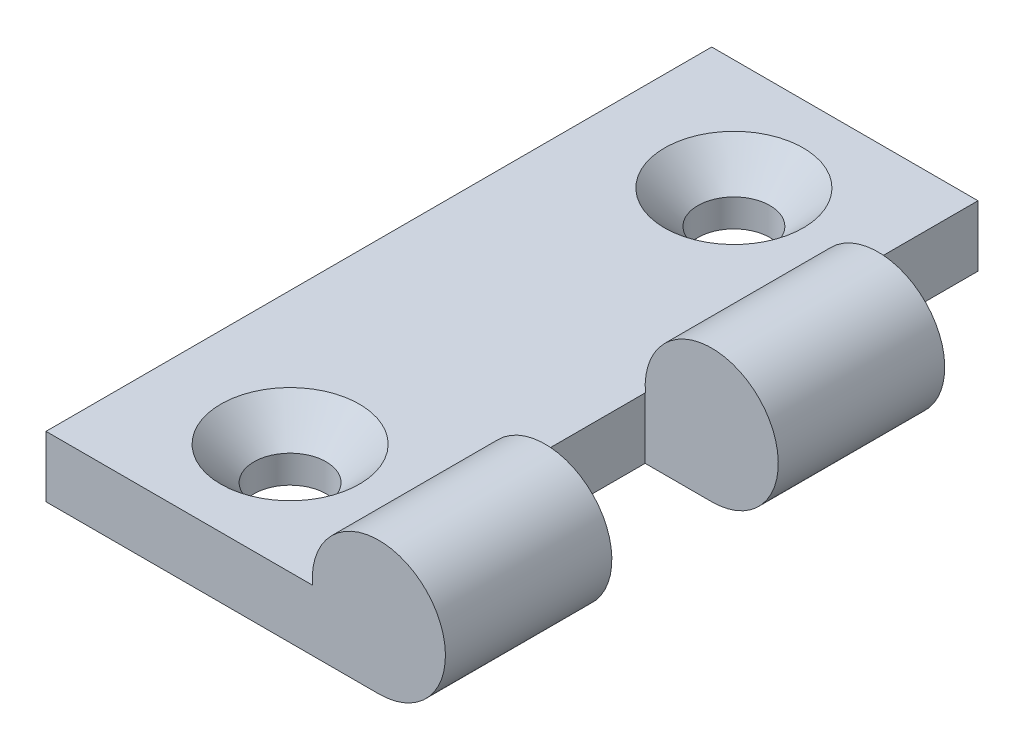
ISO-10303-21;
HEADER;
FILE_DESCRIPTION(('STEP AP214'),'2;1');
FILE_NAME('part.step','',(''),(''),'','','');
FILE_SCHEMA(('AUTOMOTIVE_DESIGN { 1 0 10303 214 1 1 1 1 }'));
ENDSEC;
DATA;
#1=APPLICATION_CONTEXT('core data for automotive mechanical design processes');
#2=APPLICATION_PROTOCOL_DEFINITION('international standard','automotive_design',2000,#1);
#3=PRODUCT_CONTEXT('',#1,'mechanical');
#4=PRODUCT('Part','Part','',(#3));
#5=PRODUCT_RELATED_PRODUCT_CATEGORY('part','',(#4));
#6=PRODUCT_DEFINITION_FORMATION('','',#4);
#7=PRODUCT_DEFINITION_CONTEXT('part definition',#1,'design');
#8=PRODUCT_DEFINITION('design','',#6,#7);
#9=PRODUCT_DEFINITION_SHAPE('','',#8);
#10=(LENGTH_UNIT() NAMED_UNIT(*) SI_UNIT(.MILLI.,.METRE.));
#11=(NAMED_UNIT(*) PLANE_ANGLE_UNIT() SI_UNIT($,.RADIAN.));
#12=(NAMED_UNIT(*) SI_UNIT($,.STERADIAN.) SOLID_ANGLE_UNIT());
#13=UNCERTAINTY_MEASURE_WITH_UNIT(LENGTH_MEASURE(1.E-05),#10,'distance_accuracy_value','');
#14=(GEOMETRIC_REPRESENTATION_CONTEXT(3) GLOBAL_UNCERTAINTY_ASSIGNED_CONTEXT((#13)) GLOBAL_UNIT_ASSIGNED_CONTEXT((#10,
#11,#12)) REPRESENTATION_CONTEXT('',''));
#15=CARTESIAN_POINT('',(0.,0.,0.));
#16=DIRECTION('',(0.,0.,1.));
#17=DIRECTION('',(1.,0.,0.));
#18=AXIS2_PLACEMENT_3D('',#15,#16,#17);
#19=CARTESIAN_POINT('',(30.,6.,-60.));
#20=DIRECTION('',(0.,0.,1.));
#21=DIRECTION('',(1.,0.,0.));
#22=AXIS2_PLACEMENT_3D('',#19,#20,#21);
#23=CYLINDRICAL_SURFACE('',#22,6.);
#24=CARTESIAN_POINT('',(30.,6.,-15.));
#25=DIRECTION('',(0.,0.,1.));
#26=DIRECTION('',(1.,0.,0.));
#27=AXIS2_PLACEMENT_3D('',#24,#25,#26);
#28=CIRCLE('',#27,6.);
#29=CARTESIAN_POINT('',(24.0208696284493,5.5,-15.));
#30=VERTEX_POINT('',#29);
#31=CARTESIAN_POINT('',(30.,0.,-15.));
#32=VERTEX_POINT('',#31);
#33=EDGE_CURVE('E59',#30,#32,#28,.F.);
#34=ORIENTED_EDGE('',*,*,#33,.F.);
#35=DIRECTION('',(0.,0.,1.));
#36=VECTOR('',#35,1.);
#37=CARTESIAN_POINT('',(24.0208696284493,5.5,-60.));
#38=LINE('',#37,#36);
#39=CARTESIAN_POINT('',(24.0208696284493,5.5,0.));
#40=VERTEX_POINT('',#39);
#41=EDGE_CURVE('E217',#30,#40,#38,.T.);
#42=ORIENTED_EDGE('',*,*,#41,.T.);
#43=CARTESIAN_POINT('',(30.,6.,0.));
#44=DIRECTION('',(0.,0.,1.));
#45=DIRECTION('',(1.,0.,0.));
#46=AXIS2_PLACEMENT_3D('',#43,#44,#45);
#47=CIRCLE('',#46,6.);
#48=CARTESIAN_POINT('',(30.,0.,0.));
#49=VERTEX_POINT('',#48);
#50=EDGE_CURVE('E205',#49,#40,#47,.T.);
#51=ORIENTED_EDGE('',*,*,#50,.F.);
#52=DIRECTION('',(0.,0.,1.));
#53=VECTOR('',#52,1.);
#54=CARTESIAN_POINT('',(30.,0.,-60.));
#55=LINE('',#54,#53);
#56=EDGE_CURVE('E221',#32,#49,#55,.T.);
#57=ORIENTED_EDGE('',*,*,#56,.F.);
#58=EDGE_LOOP('',(#34,#42,#51,#57));
#59=FACE_BOUND('',#58,.T.);
#60=ADVANCED_FACE('F42',(#59),#23,.T.);
#61=CARTESIAN_POINT('',(0.,0.,-60.));
#62=DIRECTION('',(-1.,0.,0.));
#63=DIRECTION('',(0.,0.,1.));
#64=AXIS2_PLACEMENT_3D('',#61,#62,#63);
#65=PLANE('',#64);
#66=DIRECTION('',(0.,-1.,0.));
#67=VECTOR('',#66,1.);
#68=CARTESIAN_POINT('',(0.,0.,0.));
#69=LINE('',#68,#67);
#70=CARTESIAN_POINT('',(0.,5.5,0.));
#71=VERTEX_POINT('',#70);
#72=CARTESIAN_POINT('',(0.,0.,0.));
#73=VERTEX_POINT('',#72);
#74=EDGE_CURVE('E186',#71,#73,#69,.T.);
#75=ORIENTED_EDGE('',*,*,#74,.F.);
#76=DIRECTION('',(0.,0.,1.));
#77=VECTOR('',#76,1.);
#78=CARTESIAN_POINT('',(0.,5.5,-60.));
#79=LINE('',#78,#77);
#80=CARTESIAN_POINT('',(0.,5.5,-60.));
#81=VERTEX_POINT('',#80);
#82=EDGE_CURVE('E212',#81,#71,#79,.T.);
#83=ORIENTED_EDGE('',*,*,#82,.F.);
#84=DIRECTION('',(0.,-1.,0.));
#85=VECTOR('',#84,1.);
#86=CARTESIAN_POINT('',(0.,0.,-60.));
#87=LINE('',#86,#85);
#88=CARTESIAN_POINT('',(0.,0.,-60.));
#89=VERTEX_POINT('',#88);
#90=EDGE_CURVE('E187',#81,#89,#87,.T.);
#91=ORIENTED_EDGE('',*,*,#90,.T.);
#92=DIRECTION('',(0.,0.,1.));
#93=VECTOR('',#92,1.);
#94=CARTESIAN_POINT('',(0.,0.,-60.));
#95=LINE('',#94,#93);
#96=EDGE_CURVE('E197',#89,#73,#95,.T.);
#97=ORIENTED_EDGE('',*,*,#96,.T.);
#98=EDGE_LOOP('',(#75,#83,#91,#97));
#99=FACE_BOUND('',#98,.T.);
#100=ADVANCED_FACE('F282',(#99),#65,.T.);
#101=CARTESIAN_POINT('',(0.,5.5,-60.));
#102=DIRECTION('',(0.,1.,0.));
#103=DIRECTION('',(0.,0.,1.));
#104=AXIS2_PLACEMENT_3D('',#101,#102,#103);
#105=PLANE('',#104);
#106=CARTESIAN_POINT('',(12.,5.5,-10.));
#107=DIRECTION('',(0.,1.,0.));
#108=DIRECTION('',(0.,0.,1.));
#109=AXIS2_PLACEMENT_3D('',#106,#107,#108);
#110=CIRCLE('',#109,6.25000000000003);
#111=CARTESIAN_POINT('',(12.,5.5,-3.74999999999998));
#112=VERTEX_POINT('',#111);
#113=EDGE_CURVE('E52',#112,#112,#110,.F.);
#114=ORIENTED_EDGE('',*,*,#113,.T.);
#115=EDGE_LOOP('',(#114));
#116=FACE_BOUND('',#115,.T.);
#117=CARTESIAN_POINT('',(12.,5.5,-50.));
#118=DIRECTION('',(0.,1.,0.));
#119=DIRECTION('',(0.,0.,1.));
#120=AXIS2_PLACEMENT_3D('',#117,#118,#119);
#121=CIRCLE('',#120,6.25000000000003);
#122=CARTESIAN_POINT('',(12.,5.5,-43.75));
#123=VERTEX_POINT('',#122);
#124=EDGE_CURVE('E240',#123,#123,#121,.F.);
#125=ORIENTED_EDGE('',*,*,#124,.T.);
#126=EDGE_LOOP('',(#125));
#127=FACE_BOUND('',#126,.T.);
#128=DIRECTION('',(0.,0.,1.));
#129=VECTOR('',#128,1.);
#130=CARTESIAN_POINT('',(24.,5.5,-60.));
#131=LINE('',#130,#129);
#132=CARTESIAN_POINT('',(24.,5.5,-60.));
#133=VERTEX_POINT('',#132);
#134=CARTESIAN_POINT('',(24.,5.5,-45.));
#135=VERTEX_POINT('',#134);
#136=EDGE_CURVE('E124',#133,#135,#131,.T.);
#137=ORIENTED_EDGE('',*,*,#136,.F.);
#138=DIRECTION('',(-1.,0.,0.));
#139=VECTOR('',#138,1.);
#140=CARTESIAN_POINT('',(0.,5.5,-60.));
#141=LINE('',#140,#139);
#142=EDGE_CURVE('E194',#133,#81,#141,.T.);
#143=ORIENTED_EDGE('',*,*,#142,.T.);
#144=ORIENTED_EDGE('',*,*,#82,.T.);
#145=DIRECTION('',(-1.,0.,0.));
#146=VECTOR('',#145,1.);
#147=CARTESIAN_POINT('',(0.,5.5,0.));
#148=LINE('',#147,#146);
#149=EDGE_CURVE('E191',#40,#71,#148,.T.);
#150=ORIENTED_EDGE('',*,*,#149,.F.);
#151=ORIENTED_EDGE('',*,*,#41,.F.);
#152=DIRECTION('',(1.,0.,0.));
#153=VECTOR('',#152,1.);
#154=CARTESIAN_POINT('',(0.,5.5,-15.));
#155=LINE('',#154,#153);
#156=CARTESIAN_POINT('',(24.,5.5,-15.));
#157=VERTEX_POINT('',#156);
#158=EDGE_CURVE('E169',#157,#30,#155,.T.);
#159=ORIENTED_EDGE('',*,*,#158,.F.);
#160=DIRECTION('',(0.,0.,1.));
#161=VECTOR('',#160,1.);
#162=CARTESIAN_POINT('',(24.,5.5,-60.));
#163=LINE('',#162,#161);
#164=CARTESIAN_POINT('',(24.,5.5,-30.));
#165=VERTEX_POINT('',#164);
#166=EDGE_CURVE('E178',#165,#157,#163,.T.);
#167=ORIENTED_EDGE('',*,*,#166,.F.);
#168=DIRECTION('',(-1.,0.,0.));
#169=VECTOR('',#168,1.);
#170=CARTESIAN_POINT('',(0.,5.5,-30.));
#171=LINE('',#170,#169);
#172=CARTESIAN_POINT('',(24.0208696284493,5.5,-30.));
#173=VERTEX_POINT('',#172);
#174=EDGE_CURVE('E175',#173,#165,#171,.T.);
#175=ORIENTED_EDGE('',*,*,#174,.F.);
#176=CARTESIAN_POINT('',(24.0208696284493,5.5,-45.));
#177=VERTEX_POINT('',#176);
#178=EDGE_CURVE('E216',#177,#173,#38,.T.);
#179=ORIENTED_EDGE('',*,*,#178,.F.);
#180=DIRECTION('',(1.,0.,0.));
#181=VECTOR('',#180,1.);
#182=CARTESIAN_POINT('',(0.,5.5,-45.));
#183=LINE('',#182,#181);
#184=EDGE_CURVE('E183',#135,#177,#183,.T.);
#185=ORIENTED_EDGE('',*,*,#184,.F.);
#186=EDGE_LOOP('',(#137,#143,#144,#150,#151,#159,#167,#175,#179,#185));
#187=FACE_BOUND('',#186,.T.);
#188=ADVANCED_FACE('F247',(#116,#127,#187),#105,.T.);
#189=CARTESIAN_POINT('',(30.,6.,-45.));
#190=DIRECTION('',(0.,0.,1.));
#191=DIRECTION('',(1.,0.,0.));
#192=AXIS2_PLACEMENT_3D('',#189,#190,#191);
#193=CIRCLE('',#192,6.);
#194=CARTESIAN_POINT('',(30.,0.,-45.));
#195=VERTEX_POINT('',#194);
#196=EDGE_CURVE('E134',#177,#195,#193,.F.);
#197=ORIENTED_EDGE('',*,*,#196,.F.);
#198=ORIENTED_EDGE('',*,*,#178,.T.);
#199=CARTESIAN_POINT('',(30.,6.,-30.));
#200=DIRECTION('',(0.,0.,-1.));
#201=DIRECTION('',(-1.,0.,0.));
#202=AXIS2_PLACEMENT_3D('',#199,#200,#201);
#203=CIRCLE('',#202,6.);
#204=CARTESIAN_POINT('',(30.,0.,-30.));
#205=VERTEX_POINT('',#204);
#206=EDGE_CURVE('E172',#205,#173,#203,.F.);
#207=ORIENTED_EDGE('',*,*,#206,.F.);
#208=EDGE_CURVE('E220',#195,#205,#55,.T.);
#209=ORIENTED_EDGE('',*,*,#208,.F.);
#210=EDGE_LOOP('',(#197,#198,#207,#209));
#211=FACE_BOUND('',#210,.T.);
#212=ADVANCED_FACE('F265',(#211),#23,.T.);
#213=CARTESIAN_POINT('',(0.,0.,-60.));
#214=DIRECTION('',(0.,-1.,0.));
#215=DIRECTION('',(0.,0.,-1.));
#216=AXIS2_PLACEMENT_3D('',#213,#214,#215);
#217=PLANE('',#216);
#218=CARTESIAN_POINT('',(12.,0.,-50.));
#219=DIRECTION('',(0.,-1.,0.));
#220=DIRECTION('',(0.,0.,-1.));
#221=AXIS2_PLACEMENT_3D('',#218,#219,#220);
#222=CIRCLE('',#221,3.25);
#223=CARTESIAN_POINT('',(12.,0.,-46.75));
#224=VERTEX_POINT('',#223);
#225=EDGE_CURVE('E159',#224,#224,#222,.T.);
#226=ORIENTED_EDGE('',*,*,#225,.F.);
#227=EDGE_LOOP('',(#226));
#228=FACE_BOUND('',#227,.T.);
#229=CARTESIAN_POINT('',(12.,0.,-10.));
#230=DIRECTION('',(0.,-1.,0.));
#231=DIRECTION('',(0.,0.,-1.));
#232=AXIS2_PLACEMENT_3D('',#229,#230,#231);
#233=CIRCLE('',#232,3.25);
#234=CARTESIAN_POINT('',(12.,0.,-6.75));
#235=VERTEX_POINT('',#234);
#236=EDGE_CURVE('E230',#235,#235,#233,.T.);
#237=ORIENTED_EDGE('',*,*,#236,.F.);
#238=EDGE_LOOP('',(#237));
#239=FACE_BOUND('',#238,.T.);
#240=DIRECTION('',(0.,0.,1.));
#241=VECTOR('',#240,1.);
#242=CARTESIAN_POINT('',(24.,0.,-60.));
#243=LINE('',#242,#241);
#244=CARTESIAN_POINT('',(24.,0.,-60.));
#245=VERTEX_POINT('',#244);
#246=CARTESIAN_POINT('',(24.,0.,-45.));
#247=VERTEX_POINT('',#246);
#248=EDGE_CURVE('E67',#245,#247,#243,.T.);
#249=ORIENTED_EDGE('',*,*,#248,.T.);
#250=DIRECTION('',(1.,0.,0.));
#251=VECTOR('',#250,1.);
#252=CARTESIAN_POINT('',(24.,0.,-45.));
#253=LINE('',#252,#251);
#254=EDGE_CURVE('E129',#247,#195,#253,.T.);
#255=ORIENTED_EDGE('',*,*,#254,.T.);
#256=ORIENTED_EDGE('',*,*,#208,.T.);
#257=DIRECTION('',(1.,0.,0.));
#258=VECTOR('',#257,1.);
#259=CARTESIAN_POINT('',(0.,0.,-30.));
#260=LINE('',#259,#258);
#261=CARTESIAN_POINT('',(24.,0.,-30.));
#262=VERTEX_POINT('',#261);
#263=EDGE_CURVE('E215',#262,#205,#260,.T.);
#264=ORIENTED_EDGE('',*,*,#263,.F.);
#265=DIRECTION('',(0.,0.,1.));
#266=VECTOR('',#265,1.);
#267=CARTESIAN_POINT('',(24.,0.,-30.));
#268=LINE('',#267,#266);
#269=CARTESIAN_POINT('',(24.,0.,-15.));
#270=VERTEX_POINT('',#269);
#271=EDGE_CURVE('E154',#262,#270,#268,.T.);
#272=ORIENTED_EDGE('',*,*,#271,.T.);
#273=DIRECTION('',(1.,0.,0.));
#274=VECTOR('',#273,1.);
#275=CARTESIAN_POINT('',(24.,0.,-15.));
#276=LINE('',#275,#274);
#277=EDGE_CURVE('E158',#270,#32,#276,.T.);
#278=ORIENTED_EDGE('',*,*,#277,.T.);
#279=ORIENTED_EDGE('',*,*,#56,.T.);
#280=DIRECTION('',(1.,0.,0.));
#281=VECTOR('',#280,1.);
#282=CARTESIAN_POINT('',(0.,0.,0.));
#283=LINE('',#282,#281);
#284=EDGE_CURVE('E201',#73,#49,#283,.T.);
#285=ORIENTED_EDGE('',*,*,#284,.F.);
#286=ORIENTED_EDGE('',*,*,#96,.F.);
#287=DIRECTION('',(1.,0.,0.));
#288=VECTOR('',#287,1.);
#289=CARTESIAN_POINT('',(0.,0.,-60.));
#290=LINE('',#289,#288);
#291=EDGE_CURVE('E143',#89,#245,#290,.T.);
#292=ORIENTED_EDGE('',*,*,#291,.T.);
#293=EDGE_LOOP('',(#249,#255,#256,#264,#272,#278,#279,#285,#286,#292));
#294=FACE_BOUND('',#293,.T.);
#295=ADVANCED_FACE('F141',(#228,#239,#294),#217,.T.);
#296=CARTESIAN_POINT('',(30.,6.,-60.));
#297=DIRECTION('',(0.,0.,1.));
#298=DIRECTION('',(1.,0.,0.));
#299=AXIS2_PLACEMENT_3D('',#296,#297,#298);
#300=PLANE('',#299);
#301=ORIENTED_EDGE('',*,*,#142,.F.);
#302=DIRECTION('',(0.,1.,0.));
#303=VECTOR('',#302,1.);
#304=CARTESIAN_POINT('',(24.,0.,-60.));
#305=LINE('',#304,#303);
#306=EDGE_CURVE('E128',#245,#133,#305,.T.);
#307=ORIENTED_EDGE('',*,*,#306,.F.);
#308=ORIENTED_EDGE('',*,*,#291,.F.);
#309=ORIENTED_EDGE('',*,*,#90,.F.);
#310=EDGE_LOOP('',(#301,#307,#308,#309));
#311=FACE_BOUND('',#310,.T.);
#312=ADVANCED_FACE('F264',(#311),#300,.F.);
#313=CARTESIAN_POINT('',(30.,6.,0.));
#314=DIRECTION('',(0.,0.,1.));
#315=DIRECTION('',(1.,0.,0.));
#316=AXIS2_PLACEMENT_3D('',#313,#314,#315);
#317=PLANE('',#316);
#318=ORIENTED_EDGE('',*,*,#74,.T.);
#319=ORIENTED_EDGE('',*,*,#284,.T.);
#320=ORIENTED_EDGE('',*,*,#50,.T.);
#321=ORIENTED_EDGE('',*,*,#149,.T.);
#322=EDGE_LOOP('',(#318,#319,#320,#321));
#323=FACE_BOUND('',#322,.T.);
#324=ADVANCED_FACE('F273',(#323),#317,.T.);
#325=CARTESIAN_POINT('',(24.,0.,-60.));
#326=DIRECTION('',(-1.,0.,0.));
#327=DIRECTION('',(0.,0.,1.));
#328=AXIS2_PLACEMENT_3D('',#325,#326,#327);
#329=PLANE('',#328);
#330=ORIENTED_EDGE('',*,*,#136,.T.);
#331=DIRECTION('',(0.,1.,0.));
#332=VECTOR('',#331,1.);
#333=CARTESIAN_POINT('',(24.,0.,-45.));
#334=LINE('',#333,#332);
#335=EDGE_CURVE('E120',#247,#135,#334,.T.);
#336=ORIENTED_EDGE('',*,*,#335,.F.);
#337=ORIENTED_EDGE('',*,*,#248,.F.);
#338=ORIENTED_EDGE('',*,*,#306,.T.);
#339=EDGE_LOOP('',(#330,#336,#337,#338));
#340=FACE_BOUND('',#339,.T.);
#341=ADVANCED_FACE('F122',(#340),#329,.F.);
#342=CARTESIAN_POINT('',(24.,0.,-45.));
#343=DIRECTION('',(0.,0.,1.));
#344=DIRECTION('',(1.,0.,0.));
#345=AXIS2_PLACEMENT_3D('',#342,#343,#344);
#346=PLANE('',#345);
#347=ORIENTED_EDGE('',*,*,#184,.T.);
#348=ORIENTED_EDGE('',*,*,#196,.T.);
#349=ORIENTED_EDGE('',*,*,#254,.F.);
#350=ORIENTED_EDGE('',*,*,#335,.T.);
#351=EDGE_LOOP('',(#347,#348,#349,#350));
#352=FACE_BOUND('',#351,.T.);
#353=ADVANCED_FACE('F132',(#352),#346,.F.);
#354=CARTESIAN_POINT('',(24.,0.,-30.));
#355=DIRECTION('',(-1.,0.,0.));
#356=DIRECTION('',(0.,0.,1.));
#357=AXIS2_PLACEMENT_3D('',#354,#355,#356);
#358=PLANE('',#357);
#359=ORIENTED_EDGE('',*,*,#166,.T.);
#360=DIRECTION('',(0.,1.,0.));
#361=VECTOR('',#360,1.);
#362=CARTESIAN_POINT('',(24.,0.,-15.));
#363=LINE('',#362,#361);
#364=EDGE_CURVE('E149',#270,#157,#363,.T.);
#365=ORIENTED_EDGE('',*,*,#364,.F.);
#366=ORIENTED_EDGE('',*,*,#271,.F.);
#367=DIRECTION('',(0.,1.,0.));
#368=VECTOR('',#367,1.);
#369=CARTESIAN_POINT('',(24.,0.,-30.));
#370=LINE('',#369,#368);
#371=EDGE_CURVE('E145',#262,#165,#370,.T.);
#372=ORIENTED_EDGE('',*,*,#371,.T.);
#373=EDGE_LOOP('',(#359,#365,#366,#372));
#374=FACE_BOUND('',#373,.T.);
#375=ADVANCED_FACE('F293',(#374),#358,.F.);
#376=CARTESIAN_POINT('',(24.,0.,-30.));
#377=DIRECTION('',(0.,0.,-1.));
#378=DIRECTION('',(-1.,0.,0.));
#379=AXIS2_PLACEMENT_3D('',#376,#377,#378);
#380=PLANE('',#379);
#381=ORIENTED_EDGE('',*,*,#174,.T.);
#382=ORIENTED_EDGE('',*,*,#371,.F.);
#383=ORIENTED_EDGE('',*,*,#263,.T.);
#384=ORIENTED_EDGE('',*,*,#206,.T.);
#385=EDGE_LOOP('',(#381,#382,#383,#384));
#386=FACE_BOUND('',#385,.T.);
#387=ADVANCED_FACE('F296',(#386),#380,.F.);
#388=CARTESIAN_POINT('',(24.,0.,-15.));
#389=DIRECTION('',(0.,0.,1.));
#390=DIRECTION('',(1.,0.,0.));
#391=AXIS2_PLACEMENT_3D('',#388,#389,#390);
#392=PLANE('',#391);
#393=ORIENTED_EDGE('',*,*,#158,.T.);
#394=ORIENTED_EDGE('',*,*,#33,.T.);
#395=ORIENTED_EDGE('',*,*,#277,.F.);
#396=ORIENTED_EDGE('',*,*,#364,.T.);
#397=EDGE_LOOP('',(#393,#394,#395,#396));
#398=FACE_BOUND('',#397,.T.);
#399=ADVANCED_FACE('F259',(#398),#392,.F.);
#400=CARTESIAN_POINT('',(12.,-4.5,-10.));
#401=DIRECTION('',(0.,1.,0.));
#402=DIRECTION('',(0.,0.,1.));
#403=AXIS2_PLACEMENT_3D('',#400,#401,#402);
#404=CYLINDRICAL_SURFACE('',#403,3.25);
#405=CARTESIAN_POINT('',(12.,2.49999999999998,-10.));
#406=DIRECTION('',(0.,1.,0.));
#407=DIRECTION('',(0.,0.,1.));
#408=AXIS2_PLACEMENT_3D('',#405,#406,#407);
#409=CIRCLE('',#408,3.25);
#410=CARTESIAN_POINT('',(12.,2.49999999999998,-6.75));
#411=VERTEX_POINT('',#410);
#412=EDGE_CURVE('E229',#411,#411,#409,.T.);
#413=CARTESIAN_POINT('',(12.,2.49999999999998,-6.75));
#414=CARTESIAN_POINT('',(12.,2.47395833333332,-6.75));
#415=CARTESIAN_POINT('',(12.,2.44791666666665,-6.75));
#416=CARTESIAN_POINT('',(12.,2.39583333333332,-6.75));
#417=CARTESIAN_POINT('',(12.,2.36979166666665,-6.75));
#418=CARTESIAN_POINT('',(12.,2.31770833333332,-6.75));
#419=CARTESIAN_POINT('',(12.,2.29166666666665,-6.75));
#420=CARTESIAN_POINT('',(12.,2.23958333333332,-6.75));
#421=CARTESIAN_POINT('',(12.,2.21354166666665,-6.75));
#422=CARTESIAN_POINT('',(12.,2.16145833333332,-6.75));
#423=CARTESIAN_POINT('',(12.,2.13541666666665,-6.75));
#424=CARTESIAN_POINT('',(12.,2.08333333333332,-6.75));
#425=CARTESIAN_POINT('',(12.,2.05729166666665,-6.75));
#426=CARTESIAN_POINT('',(12.,2.00520833333332,-6.75));
#427=CARTESIAN_POINT('',(12.,1.97916666666665,-6.75));
#428=CARTESIAN_POINT('',(12.,1.92708333333332,-6.75));
#429=CARTESIAN_POINT('',(12.,1.90104166666665,-6.75));
#430=CARTESIAN_POINT('',(12.,1.84895833333332,-6.75));
#431=CARTESIAN_POINT('',(12.,1.82291666666666,-6.75));
#432=CARTESIAN_POINT('',(12.,1.77083333333332,-6.75));
#433=CARTESIAN_POINT('',(12.,1.74479166666666,-6.75));
#434=CARTESIAN_POINT('',(12.,1.69270833333332,-6.75));
#435=CARTESIAN_POINT('',(12.,1.66666666666666,-6.75));
#436=CARTESIAN_POINT('',(12.,1.61458333333332,-6.75));
#437=CARTESIAN_POINT('',(12.,1.58854166666666,-6.75));
#438=CARTESIAN_POINT('',(12.,1.53645833333332,-6.75));
#439=CARTESIAN_POINT('',(12.,1.51041666666666,-6.75));
#440=CARTESIAN_POINT('',(12.,1.45833333333332,-6.75));
#441=CARTESIAN_POINT('',(12.,1.43229166666666,-6.75));
#442=CARTESIAN_POINT('',(12.,1.38020833333333,-6.75));
#443=CARTESIAN_POINT('',(12.,1.35416666666666,-6.75));
#444=CARTESIAN_POINT('',(12.,1.30208333333333,-6.75));
#445=CARTESIAN_POINT('',(12.,1.27604166666666,-6.75));
#446=CARTESIAN_POINT('',(12.,1.22395833333333,-6.75));
#447=CARTESIAN_POINT('',(12.,1.19791666666666,-6.75));
#448=CARTESIAN_POINT('',(12.,1.14583333333333,-6.75));
#449=CARTESIAN_POINT('',(12.,1.11979166666666,-6.75));
#450=CARTESIAN_POINT('',(12.,1.06770833333333,-6.75));
#451=CARTESIAN_POINT('',(12.,1.04166666666666,-6.75));
#452=CARTESIAN_POINT('',(12.,0.989583333333327,-6.75));
#453=CARTESIAN_POINT('',(12.,0.963541666666661,-6.75));
#454=CARTESIAN_POINT('',(12.,0.911458333333327,-6.75));
#455=CARTESIAN_POINT('',(12.,0.885416666666661,-6.75));
#456=CARTESIAN_POINT('',(12.,0.833333333333328,-6.75));
#457=CARTESIAN_POINT('',(12.,0.807291666666662,-6.75));
#458=CARTESIAN_POINT('',(12.,0.755208333333329,-6.75));
#459=CARTESIAN_POINT('',(12.,0.729166666666662,-6.75));
#460=CARTESIAN_POINT('',(12.,0.677083333333329,-6.75));
#461=CARTESIAN_POINT('',(12.,0.651041666666663,-6.75));
#462=CARTESIAN_POINT('',(12.,0.59895833333333,-6.75));
#463=CARTESIAN_POINT('',(12.,0.572916666666663,-6.75));
#464=CARTESIAN_POINT('',(12.,0.52083333333333,-6.75));
#465=CARTESIAN_POINT('',(12.,0.494791666666664,-6.75));
#466=CARTESIAN_POINT('',(12.,0.442708333333331,-6.75));
#467=CARTESIAN_POINT('',(12.,0.416666666666664,-6.75));
#468=CARTESIAN_POINT('',(12.,0.364583333333331,-6.75));
#469=CARTESIAN_POINT('',(12.,0.338541666666665,-6.75));
#470=CARTESIAN_POINT('',(12.,0.286458333333332,-6.75));
#471=CARTESIAN_POINT('',(12.,0.260416666666665,-6.75));
#472=CARTESIAN_POINT('',(12.,0.208333333333332,-6.75));
#473=CARTESIAN_POINT('',(12.,0.182291666666666,-6.75));
#474=CARTESIAN_POINT('',(12.,0.130208333333333,-6.75));
#475=CARTESIAN_POINT('',(12.,0.104166666666666,-6.75));
#476=CARTESIAN_POINT('',(12.,0.0520833333333334,-6.75));
#477=CARTESIAN_POINT('',(12.,0.0260416666666667,-6.75));
#478=CARTESIAN_POINT('',(12.,0.,-6.75));
#479=B_SPLINE_CURVE_WITH_KNOTS('',3,(#413,#414,#415,#416,#417,#418,#419,#420,#421,#422,#423,
#424,#425,#426,#427,#428,#429,#430,#431,#432,#433,#434,#435,#436,#437,#438,#439,#440,#441,#442,
#443,#444,#445,#446,#447,#448,#449,#450,#451,#452,#453,#454,#455,#456,#457,#458,#459,#460,#461,
#462,#463,#464,#465,#466,#467,#468,#469,#470,#471,#472,#473,#474,#475,#476,#477,#478),
.UNSPECIFIED.,.F.,.F.,(4,2,2,2,2,2,2,2,2,2,2,2,2,2,2,2,2,2,2,2,2,2,2,2,2,2,2,2,2,2,2,2,4),(0.,
0.0781249999999992,0.156249999999999,0.234374999999998,0.312499999999999,0.390624999999998,
0.468749999999997,0.546874999999997,0.624999999999996,0.703124999999995,0.781249999999995,
0.859374999999995,0.937499999999994,1.01562499999999,1.09374999999999,1.17187499999999,
1.24999999999999,1.32812499999999,1.40624999999999,1.48437499999999,1.56249999999999,
1.64062499999999,1.71874999999999,1.79687499999999,1.87499999999999,1.95312499999999,
2.03124999999999,2.10937499999999,2.18749999999999,2.26562499999999,2.34374999999999,
2.42187499999998,2.49999999999998),.UNSPECIFIED.);
#480=EDGE_CURVE('BSEAM256',#411,#235,#479,.T.);
#481=ORIENTED_EDGE('',*,*,#412,.T.);
#482=ORIENTED_EDGE('',*,*,#236,.T.);
#483=ORIENTED_EDGE('',*,*,#480,.T.);
#484=ORIENTED_EDGE('',*,*,#480,.F.);
#485=EDGE_LOOP('',(#481,#483,#482,#484));
#486=FACE_BOUND('',#485,.T.);
#487=ADVANCED_FACE('F256',(#486),#404,.F.);
#488=CARTESIAN_POINT('',(12.,-4.5,-50.));
#489=DIRECTION('',(0.,1.,0.));
#490=DIRECTION('',(0.,0.,1.));
#491=AXIS2_PLACEMENT_3D('',#488,#489,#490);
#492=CYLINDRICAL_SURFACE('',#491,3.25);
#493=CARTESIAN_POINT('',(12.,2.49999999999998,-50.));
#494=DIRECTION('',(0.,1.,0.));
#495=DIRECTION('',(0.,0.,1.));
#496=AXIS2_PLACEMENT_3D('',#493,#494,#495);
#497=CIRCLE('',#496,3.25);
#498=CARTESIAN_POINT('',(12.,2.49999999999998,-46.75));
#499=VERTEX_POINT('',#498);
#500=EDGE_CURVE('E11',#499,#499,#497,.T.);
#501=CARTESIAN_POINT('',(12.,2.49999999999998,-46.75));
#502=CARTESIAN_POINT('',(12.,2.47395833333332,-46.75));
#503=CARTESIAN_POINT('',(12.,2.44791666666665,-46.75));
#504=CARTESIAN_POINT('',(12.,2.39583333333332,-46.75));
#505=CARTESIAN_POINT('',(12.,2.36979166666665,-46.75));
#506=CARTESIAN_POINT('',(12.,2.31770833333332,-46.75));
#507=CARTESIAN_POINT('',(12.,2.29166666666665,-46.75));
#508=CARTESIAN_POINT('',(12.,2.23958333333332,-46.75));
#509=CARTESIAN_POINT('',(12.,2.21354166666665,-46.75));
#510=CARTESIAN_POINT('',(12.,2.16145833333332,-46.75));
#511=CARTESIAN_POINT('',(12.,2.13541666666665,-46.75));
#512=CARTESIAN_POINT('',(12.,2.08333333333332,-46.75));
#513=CARTESIAN_POINT('',(12.,2.05729166666665,-46.75));
#514=CARTESIAN_POINT('',(12.,2.00520833333332,-46.75));
#515=CARTESIAN_POINT('',(12.,1.97916666666665,-46.75));
#516=CARTESIAN_POINT('',(12.,1.92708333333332,-46.75));
#517=CARTESIAN_POINT('',(12.,1.90104166666665,-46.75));
#518=CARTESIAN_POINT('',(12.,1.84895833333332,-46.75));
#519=CARTESIAN_POINT('',(12.,1.82291666666666,-46.75));
#520=CARTESIAN_POINT('',(12.,1.77083333333332,-46.75));
#521=CARTESIAN_POINT('',(12.,1.74479166666666,-46.75));
#522=CARTESIAN_POINT('',(12.,1.69270833333332,-46.75));
#523=CARTESIAN_POINT('',(12.,1.66666666666666,-46.75));
#524=CARTESIAN_POINT('',(12.,1.61458333333332,-46.75));
#525=CARTESIAN_POINT('',(12.,1.58854166666666,-46.75));
#526=CARTESIAN_POINT('',(12.,1.53645833333332,-46.75));
#527=CARTESIAN_POINT('',(12.,1.51041666666666,-46.75));
#528=CARTESIAN_POINT('',(12.,1.45833333333332,-46.75));
#529=CARTESIAN_POINT('',(12.,1.43229166666666,-46.75));
#530=CARTESIAN_POINT('',(12.,1.38020833333333,-46.75));
#531=CARTESIAN_POINT('',(12.,1.35416666666666,-46.75));
#532=CARTESIAN_POINT('',(12.,1.30208333333333,-46.75));
#533=CARTESIAN_POINT('',(12.,1.27604166666666,-46.75));
#534=CARTESIAN_POINT('',(12.,1.22395833333333,-46.75));
#535=CARTESIAN_POINT('',(12.,1.19791666666666,-46.75));
#536=CARTESIAN_POINT('',(12.,1.14583333333333,-46.75));
#537=CARTESIAN_POINT('',(12.,1.11979166666666,-46.75));
#538=CARTESIAN_POINT('',(12.,1.06770833333333,-46.75));
#539=CARTESIAN_POINT('',(12.,1.04166666666666,-46.75));
#540=CARTESIAN_POINT('',(12.,0.989583333333327,-46.75));
#541=CARTESIAN_POINT('',(12.,0.963541666666661,-46.75));
#542=CARTESIAN_POINT('',(12.,0.911458333333327,-46.75));
#543=CARTESIAN_POINT('',(12.,0.885416666666661,-46.75));
#544=CARTESIAN_POINT('',(12.,0.833333333333328,-46.75));
#545=CARTESIAN_POINT('',(12.,0.807291666666662,-46.75));
#546=CARTESIAN_POINT('',(12.,0.755208333333329,-46.75));
#547=CARTESIAN_POINT('',(12.,0.729166666666662,-46.75));
#548=CARTESIAN_POINT('',(12.,0.677083333333329,-46.75));
#549=CARTESIAN_POINT('',(12.,0.651041666666663,-46.75));
#550=CARTESIAN_POINT('',(12.,0.59895833333333,-46.75));
#551=CARTESIAN_POINT('',(12.,0.572916666666663,-46.75));
#552=CARTESIAN_POINT('',(12.,0.52083333333333,-46.75));
#553=CARTESIAN_POINT('',(12.,0.494791666666664,-46.75));
#554=CARTESIAN_POINT('',(12.,0.442708333333331,-46.75));
#555=CARTESIAN_POINT('',(12.,0.416666666666664,-46.75));
#556=CARTESIAN_POINT('',(12.,0.364583333333331,-46.75));
#557=CARTESIAN_POINT('',(12.,0.338541666666665,-46.75));
#558=CARTESIAN_POINT('',(12.,0.286458333333332,-46.75));
#559=CARTESIAN_POINT('',(12.,0.260416666666665,-46.75));
#560=CARTESIAN_POINT('',(12.,0.208333333333332,-46.75));
#561=CARTESIAN_POINT('',(12.,0.182291666666666,-46.75));
#562=CARTESIAN_POINT('',(12.,0.130208333333333,-46.75));
#563=CARTESIAN_POINT('',(12.,0.104166666666666,-46.75));
#564=CARTESIAN_POINT('',(12.,0.0520833333333334,-46.75));
#565=CARTESIAN_POINT('',(12.,0.0260416666666667,-46.75));
#566=CARTESIAN_POINT('',(12.,0.,-46.75));
#567=B_SPLINE_CURVE_WITH_KNOTS('',3,(#501,#502,#503,#504,#505,#506,#507,#508,#509,#510,#511,
#512,#513,#514,#515,#516,#517,#518,#519,#520,#521,#522,#523,#524,#525,#526,#527,#528,#529,#530,
#531,#532,#533,#534,#535,#536,#537,#538,#539,#540,#541,#542,#543,#544,#545,#546,#547,#548,#549,
#550,#551,#552,#553,#554,#555,#556,#557,#558,#559,#560,#561,#562,#563,#564,#565,#566),
.UNSPECIFIED.,.F.,.F.,(4,2,2,2,2,2,2,2,2,2,2,2,2,2,2,2,2,2,2,2,2,2,2,2,2,2,2,2,2,2,2,2,4),(0.,
0.0781249999999992,0.156249999999999,0.234374999999998,0.312499999999999,0.390624999999998,
0.468749999999997,0.546874999999997,0.624999999999996,0.703124999999995,0.781249999999995,
0.859374999999995,0.937499999999994,1.01562499999999,1.09374999999999,1.17187499999999,
1.24999999999999,1.32812499999999,1.40624999999999,1.48437499999999,1.56249999999999,
1.64062499999999,1.71874999999999,1.79687499999999,1.87499999999999,1.95312499999999,
2.03124999999999,2.10937499999999,2.18749999999999,2.26562499999999,2.34374999999999,
2.42187499999998,2.49999999999998),.UNSPECIFIED.);
#568=EDGE_CURVE('BSEAM253',#499,#224,#567,.T.);
#569=ORIENTED_EDGE('',*,*,#500,.T.);
#570=ORIENTED_EDGE('',*,*,#225,.T.);
#571=ORIENTED_EDGE('',*,*,#568,.T.);
#572=ORIENTED_EDGE('',*,*,#568,.F.);
#573=EDGE_LOOP('',(#569,#571,#570,#572));
#574=FACE_BOUND('',#573,.T.);
#575=ADVANCED_FACE('F253',(#574),#492,.F.);
#576=CARTESIAN_POINT('',(12.,2.49999999999998,-10.));
#577=DIRECTION('',(0.,1.,0.));
#578=DIRECTION('',(0.,0.,1.));
#579=AXIS2_PLACEMENT_3D('',#576,#577,#578);
#580=CONICAL_SURFACE('',#579,3.25,0.78539816339745);
#581=CARTESIAN_POINT('',(12.,5.5,-3.74999999999998));
#582=CARTESIAN_POINT('',(12.,5.46875,-3.78124999999998));
#583=CARTESIAN_POINT('',(12.,5.4375,-3.81249999999998));
#584=CARTESIAN_POINT('',(12.,5.375,-3.87499999999998));
#585=CARTESIAN_POINT('',(12.,5.34375,-3.90624999999998));
#586=CARTESIAN_POINT('',(12.,5.28125,-3.96874999999998));
#587=CARTESIAN_POINT('',(12.,5.25,-3.99999999999998));
#588=CARTESIAN_POINT('',(12.,5.1875,-4.06249999999998));
#589=CARTESIAN_POINT('',(12.,5.15625,-4.09374999999998));
#590=CARTESIAN_POINT('',(12.,5.09375,-4.15624999999998));
#591=CARTESIAN_POINT('',(12.,5.0625,-4.18749999999998));
#592=CARTESIAN_POINT('',(12.,5.,-4.24999999999998));
#593=CARTESIAN_POINT('',(12.,4.96875,-4.28124999999998));
#594=CARTESIAN_POINT('',(12.,4.90625,-4.34374999999998));
#595=CARTESIAN_POINT('',(12.,4.875,-4.37499999999998));
#596=CARTESIAN_POINT('',(12.,4.8125,-4.43749999999998));
#597=CARTESIAN_POINT('',(12.,4.78125,-4.46874999999998));
#598=CARTESIAN_POINT('',(12.,4.71875,-4.53124999999998));
#599=CARTESIAN_POINT('',(12.,4.6875,-4.56249999999998));
#600=CARTESIAN_POINT('',(12.,4.625,-4.62499999999998));
#601=CARTESIAN_POINT('',(12.,4.59374999999999,-4.65624999999998));
#602=CARTESIAN_POINT('',(12.,4.53124999999999,-4.71874999999998));
#603=CARTESIAN_POINT('',(12.,4.49999999999999,-4.74999999999998));
#604=CARTESIAN_POINT('',(12.,4.43749999999999,-4.81249999999998));
#605=CARTESIAN_POINT('',(12.,4.40624999999999,-4.84374999999998));
#606=CARTESIAN_POINT('',(12.,4.34374999999999,-4.90624999999998));
#607=CARTESIAN_POINT('',(12.,4.31249999999999,-4.93749999999999));
#608=CARTESIAN_POINT('',(12.,4.24999999999999,-4.99999999999999));
#609=CARTESIAN_POINT('',(12.,4.21874999999999,-5.03124999999999));
#610=CARTESIAN_POINT('',(12.,4.15624999999999,-5.09374999999999));
#611=CARTESIAN_POINT('',(12.,4.12499999999999,-5.12499999999999));
#612=CARTESIAN_POINT('',(12.,4.06249999999999,-5.18749999999999));
#613=CARTESIAN_POINT('',(12.,4.03124999999999,-5.21874999999999));
#614=CARTESIAN_POINT('',(12.,3.96874999999999,-5.28124999999999));
#615=CARTESIAN_POINT('',(12.,3.93749999999999,-5.31249999999999));
#616=CARTESIAN_POINT('',(12.,3.87499999999999,-5.37499999999999));
#617=CARTESIAN_POINT('',(12.,3.84374999999999,-5.40624999999999));
#618=CARTESIAN_POINT('',(12.,3.78124999999999,-5.46874999999999));
#619=CARTESIAN_POINT('',(12.,3.74999999999999,-5.49999999999999));
#620=CARTESIAN_POINT('',(12.,3.68749999999999,-5.56249999999999));
#621=CARTESIAN_POINT('',(12.,3.65624999999999,-5.59374999999999));
#622=CARTESIAN_POINT('',(12.,3.59374999999999,-5.65624999999999));
#623=CARTESIAN_POINT('',(12.,3.56249999999999,-5.68749999999999));
#624=CARTESIAN_POINT('',(12.,3.49999999999999,-5.74999999999999));
#625=CARTESIAN_POINT('',(12.,3.46874999999999,-5.78124999999999));
#626=CARTESIAN_POINT('',(12.,3.40624999999999,-5.84374999999999));
#627=CARTESIAN_POINT('',(12.,3.37499999999999,-5.87499999999999));
#628=CARTESIAN_POINT('',(12.,3.31249999999999,-5.93749999999999));
#629=CARTESIAN_POINT('',(12.,3.28124999999999,-5.96874999999999));
#630=CARTESIAN_POINT('',(12.,3.21874999999999,-6.03124999999999));
#631=CARTESIAN_POINT('',(12.,3.18749999999999,-6.0625));
#632=CARTESIAN_POINT('',(12.,3.12499999999999,-6.125));
#633=CARTESIAN_POINT('',(12.,3.09374999999999,-6.15625));
#634=CARTESIAN_POINT('',(12.,3.03124999999999,-6.21875));
#635=CARTESIAN_POINT('',(12.,2.99999999999999,-6.25));
#636=CARTESIAN_POINT('',(12.,2.93749999999999,-6.3125));
#637=CARTESIAN_POINT('',(12.,2.90624999999999,-6.34375));
#638=CARTESIAN_POINT('',(12.,2.84374999999999,-6.40625));
#639=CARTESIAN_POINT('',(12.,2.81249999999999,-6.4375));
#640=CARTESIAN_POINT('',(12.,2.74999999999999,-6.5));
#641=CARTESIAN_POINT('',(12.,2.71874999999999,-6.53125));
#642=CARTESIAN_POINT('',(12.,2.65624999999999,-6.59375));
#643=CARTESIAN_POINT('',(12.,2.62499999999999,-6.625));
#644=CARTESIAN_POINT('',(12.,2.56249999999999,-6.6875));
#645=CARTESIAN_POINT('',(12.,2.53124999999998,-6.71875));
#646=CARTESIAN_POINT('',(12.,2.49999999999998,-6.75));
#647=B_SPLINE_CURVE_WITH_KNOTS('',3,(#581,#582,#583,#584,#585,#586,#587,#588,#589,#590,#591,
#592,#593,#594,#595,#596,#597,#598,#599,#600,#601,#602,#603,#604,#605,#606,#607,#608,#609,#610,
#611,#612,#613,#614,#615,#616,#617,#618,#619,#620,#621,#622,#623,#624,#625,#626,#627,#628,#629,
#630,#631,#632,#633,#634,#635,#636,#637,#638,#639,#640,#641,#642,#643,#644,#645,#646),
.UNSPECIFIED.,.F.,.F.,(4,2,2,2,2,2,2,2,2,2,2,2,2,2,2,2,2,2,2,2,2,2,2,2,2,2,2,2,2,2,2,2,4),(0.,
0.132582521472479,0.265165042944958,0.397747564417436,0.530330085889915,0.662912607362393,
0.795495128834872,0.928077650307351,1.06066017177983,1.19324269325231,1.32582521472479,
1.45840773619727,1.59099025766974,1.72357277914222,1.8561553006147,1.98873782208718,
2.12132034355966,2.25390286503214,2.38648538650461,2.51906790797709,2.65165042944957,
2.78423295092205,2.91681547239453,3.04939799386701,3.18198051533949,3.31456303681197,
3.44714555828444,3.57972807975692,3.7123106012294,3.84489312270188,3.97747564417436,
4.11005816564684,4.24264068711932),.UNSPECIFIED.);
#648=EDGE_CURVE('BSEAM250',#112,#411,#647,.T.);
#649=ORIENTED_EDGE('',*,*,#113,.F.);
#650=ORIENTED_EDGE('',*,*,#412,.F.);
#651=ORIENTED_EDGE('',*,*,#648,.T.);
#652=ORIENTED_EDGE('',*,*,#648,.F.);
#653=EDGE_LOOP('',(#649,#651,#650,#652));
#654=FACE_BOUND('',#653,.T.);
#655=ADVANCED_FACE('F250',(#654),#580,.F.);
#656=CARTESIAN_POINT('',(12.,2.49999999999998,-50.));
#657=DIRECTION('',(0.,1.,0.));
#658=DIRECTION('',(0.,0.,1.));
#659=AXIS2_PLACEMENT_3D('',#656,#657,#658);
#660=CONICAL_SURFACE('',#659,3.25,0.78539816339745);
#661=CARTESIAN_POINT('',(12.,5.5,-43.75));
#662=CARTESIAN_POINT('',(12.,5.46875,-43.78125));
#663=CARTESIAN_POINT('',(12.,5.4375,-43.8125));
#664=CARTESIAN_POINT('',(12.,5.375,-43.875));
#665=CARTESIAN_POINT('',(12.,5.34375,-43.90625));
#666=CARTESIAN_POINT('',(12.,5.28125,-43.96875));
#667=CARTESIAN_POINT('',(12.,5.25,-44.));
#668=CARTESIAN_POINT('',(12.,5.1875,-44.0625));
#669=CARTESIAN_POINT('',(12.,5.15625,-44.09375));
#670=CARTESIAN_POINT('',(12.,5.09375,-44.15625));
#671=CARTESIAN_POINT('',(12.,5.0625,-44.1875));
#672=CARTESIAN_POINT('',(12.,5.,-44.25));
#673=CARTESIAN_POINT('',(12.,4.96875,-44.28125));
#674=CARTESIAN_POINT('',(12.,4.90625,-44.34375));
#675=CARTESIAN_POINT('',(12.,4.875,-44.375));
#676=CARTESIAN_POINT('',(12.,4.8125,-44.4375));
#677=CARTESIAN_POINT('',(12.,4.78125,-44.46875));
#678=CARTESIAN_POINT('',(12.,4.71875,-44.53125));
#679=CARTESIAN_POINT('',(12.,4.6875,-44.5625));
#680=CARTESIAN_POINT('',(12.,4.62499999999999,-44.625));
#681=CARTESIAN_POINT('',(12.,4.59374999999999,-44.65625));
#682=CARTESIAN_POINT('',(12.,4.53124999999999,-44.71875));
#683=CARTESIAN_POINT('',(12.,4.49999999999999,-44.75));
#684=CARTESIAN_POINT('',(12.,4.43749999999999,-44.8125));
#685=CARTESIAN_POINT('',(12.,4.40624999999999,-44.84375));
#686=CARTESIAN_POINT('',(12.,4.34374999999999,-44.90625));
#687=CARTESIAN_POINT('',(12.,4.31249999999999,-44.9375));
#688=CARTESIAN_POINT('',(12.,4.24999999999999,-45.));
#689=CARTESIAN_POINT('',(12.,4.21874999999999,-45.03125));
#690=CARTESIAN_POINT('',(12.,4.15624999999999,-45.09375));
#691=CARTESIAN_POINT('',(12.,4.12499999999999,-45.125));
#692=CARTESIAN_POINT('',(12.,4.06249999999999,-45.1875));
#693=CARTESIAN_POINT('',(12.,4.03124999999999,-45.21875));
#694=CARTESIAN_POINT('',(12.,3.96874999999999,-45.28125));
#695=CARTESIAN_POINT('',(12.,3.93749999999999,-45.3125));
#696=CARTESIAN_POINT('',(12.,3.87499999999999,-45.375));
#697=CARTESIAN_POINT('',(12.,3.84374999999999,-45.40625));
#698=CARTESIAN_POINT('',(12.,3.78124999999999,-45.46875));
#699=CARTESIAN_POINT('',(12.,3.74999999999999,-45.5));
#700=CARTESIAN_POINT('',(12.,3.68749999999999,-45.5625));
#701=CARTESIAN_POINT('',(12.,3.65624999999999,-45.59375));
#702=CARTESIAN_POINT('',(12.,3.59374999999999,-45.65625));
#703=CARTESIAN_POINT('',(12.,3.56249999999999,-45.6875));
#704=CARTESIAN_POINT('',(12.,3.49999999999999,-45.75));
#705=CARTESIAN_POINT('',(12.,3.46874999999999,-45.78125));
#706=CARTESIAN_POINT('',(12.,3.40624999999999,-45.84375));
#707=CARTESIAN_POINT('',(12.,3.37499999999999,-45.875));
#708=CARTESIAN_POINT('',(12.,3.31249999999999,-45.9375));
#709=CARTESIAN_POINT('',(12.,3.28124999999999,-45.96875));
#710=CARTESIAN_POINT('',(12.,3.21874999999999,-46.03125));
#711=CARTESIAN_POINT('',(12.,3.18749999999999,-46.0625));
#712=CARTESIAN_POINT('',(12.,3.12499999999999,-46.125));
#713=CARTESIAN_POINT('',(12.,3.09374999999999,-46.15625));
#714=CARTESIAN_POINT('',(12.,3.03124999999999,-46.21875));
#715=CARTESIAN_POINT('',(12.,2.99999999999999,-46.25));
#716=CARTESIAN_POINT('',(12.,2.93749999999999,-46.3125));
#717=CARTESIAN_POINT('',(12.,2.90624999999999,-46.34375));
#718=CARTESIAN_POINT('',(12.,2.84374999999999,-46.40625));
#719=CARTESIAN_POINT('',(12.,2.81249999999999,-46.4375));
#720=CARTESIAN_POINT('',(12.,2.74999999999999,-46.5));
#721=CARTESIAN_POINT('',(12.,2.71874999999999,-46.53125));
#722=CARTESIAN_POINT('',(12.,2.65624999999999,-46.59375));
#723=CARTESIAN_POINT('',(12.,2.62499999999999,-46.625));
#724=CARTESIAN_POINT('',(12.,2.56249999999999,-46.6875));
#725=CARTESIAN_POINT('',(12.,2.53124999999999,-46.71875));
#726=CARTESIAN_POINT('',(12.,2.49999999999998,-46.75));
#727=B_SPLINE_CURVE_WITH_KNOTS('',3,(#661,#662,#663,#664,#665,#666,#667,#668,#669,#670,#671,
#672,#673,#674,#675,#676,#677,#678,#679,#680,#681,#682,#683,#684,#685,#686,#687,#688,#689,#690,
#691,#692,#693,#694,#695,#696,#697,#698,#699,#700,#701,#702,#703,#704,#705,#706,#707,#708,#709,
#710,#711,#712,#713,#714,#715,#716,#717,#718,#719,#720,#721,#722,#723,#724,#725,#726),
.UNSPECIFIED.,.F.,.F.,(4,2,2,2,2,2,2,2,2,2,2,2,2,2,2,2,2,2,2,2,2,2,2,2,2,2,2,2,2,2,2,2,4),(0.,
0.132582521472476,0.265165042944957,0.397747564417437,0.530330085889912,0.662912607362393,
0.795495128834869,0.928077650307349,1.06066017177983,1.1932426932523,1.32582521472479,
1.45840773619727,1.59099025766974,1.72357277914222,1.8561553006147,1.98873782208718,
2.12132034355966,2.25390286503213,2.38648538650461,2.51906790797709,2.65165042944957,
2.78423295092205,2.91681547239453,3.04939799386701,3.18198051533948,3.31456303681196,
3.44714555828444,3.57972807975692,3.7123106012294,3.84489312270187,3.97747564417436,
4.11005816564684,4.24264068711931),.UNSPECIFIED.);
#728=EDGE_CURVE('BSEAM45',#123,#499,#727,.T.);
#729=ORIENTED_EDGE('',*,*,#124,.F.);
#730=ORIENTED_EDGE('',*,*,#500,.F.);
#731=ORIENTED_EDGE('',*,*,#728,.T.);
#732=ORIENTED_EDGE('',*,*,#728,.F.);
#733=EDGE_LOOP('',(#729,#731,#730,#732));
#734=FACE_BOUND('',#733,.T.);
#735=ADVANCED_FACE('F45',(#734),#660,.F.);
#736=CLOSED_SHELL('',(#60,#100,#188,#212,#295,#312,#324,#341,#353,#375,#387,#399,#487,#575,#655,#735));
#737=MANIFOLD_SOLID_BREP('B2',#736);
#738=ADVANCED_BREP_SHAPE_REPRESENTATION('',(#18,#737),#14);
#739=SHAPE_DEFINITION_REPRESENTATION(#9,#738);
ENDSEC;
END-ISO-10303-21;
